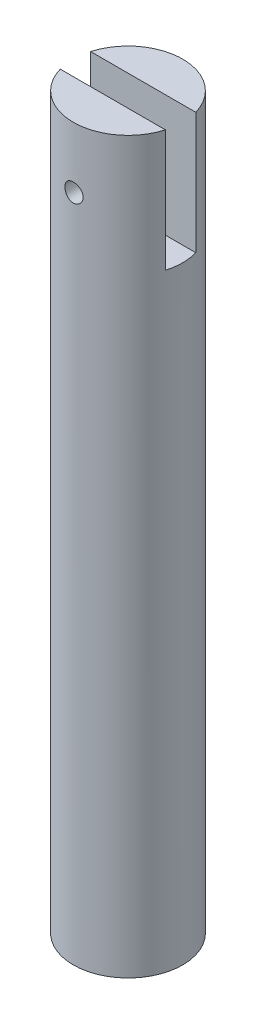
ISO-10303-21;
HEADER;
FILE_DESCRIPTION(('STEP AP214'),'2;1');
FILE_NAME('part.step','',(''),(''),'','','');
FILE_SCHEMA(('AUTOMOTIVE_DESIGN { 1 0 10303 214 1 1 1 1 }'));
ENDSEC;
DATA;
#1=APPLICATION_CONTEXT('core data for automotive mechanical design processes');
#2=APPLICATION_PROTOCOL_DEFINITION('international standard','automotive_design',2000,#1);
#3=PRODUCT_CONTEXT('',#1,'mechanical');
#4=PRODUCT('Part','Part','',(#3));
#5=PRODUCT_RELATED_PRODUCT_CATEGORY('part','',(#4));
#6=PRODUCT_DEFINITION_FORMATION('','',#4);
#7=PRODUCT_DEFINITION_CONTEXT('part definition',#1,'design');
#8=PRODUCT_DEFINITION('design','',#6,#7);
#9=PRODUCT_DEFINITION_SHAPE('','',#8);
#10=(LENGTH_UNIT() NAMED_UNIT(*) SI_UNIT(.MILLI.,.METRE.));
#11=(NAMED_UNIT(*) PLANE_ANGLE_UNIT() SI_UNIT($,.RADIAN.));
#12=(NAMED_UNIT(*) SI_UNIT($,.STERADIAN.) SOLID_ANGLE_UNIT());
#13=UNCERTAINTY_MEASURE_WITH_UNIT(LENGTH_MEASURE(1.E-05),#10,'distance_accuracy_value','');
#14=(GEOMETRIC_REPRESENTATION_CONTEXT(3) GLOBAL_UNCERTAINTY_ASSIGNED_CONTEXT((#13)) GLOBAL_UNIT_ASSIGNED_CONTEXT((#10,
#11,#12)) REPRESENTATION_CONTEXT('',''));
#15=CARTESIAN_POINT('',(0.,0.,0.));
#16=DIRECTION('',(0.,0.,1.));
#17=DIRECTION('',(1.,0.,0.));
#18=AXIS2_PLACEMENT_3D('',#15,#16,#17);
#19=CARTESIAN_POINT('',(0.,120.,0.));
#20=DIRECTION('',(0.,1.,0.));
#21=DIRECTION('',(0.,0.,1.));
#22=AXIS2_PLACEMENT_3D('',#19,#20,#21);
#23=PLANE('',#22);
#24=DIRECTION('',(1.,0.,0.));
#25=VECTOR('',#24,1.);
#26=CARTESIAN_POINT('',(0.,120.,5.));
#27=LINE('',#26,#25);
#28=CARTESIAN_POINT('',(-17.2916164657906,120.,5.));
#29=VERTEX_POINT('',#28);
#30=CARTESIAN_POINT('',(17.2916164657906,120.,5.));
#31=VERTEX_POINT('',#30);
#32=EDGE_CURVE('E82',#29,#31,#27,.T.);
#33=ORIENTED_EDGE('',*,*,#32,.F.);
#34=CARTESIAN_POINT('',(0.,120.,0.));
#35=DIRECTION('',(0.,1.,0.));
#36=DIRECTION('',(0.,0.,1.));
#37=AXIS2_PLACEMENT_3D('',#34,#35,#36);
#38=CIRCLE('',#37,18.);
#39=EDGE_CURVE('E93',#29,#31,#38,.T.);
#40=ORIENTED_EDGE('',*,*,#39,.T.);
#41=EDGE_LOOP('',(#33,#40));
#42=FACE_BOUND('',#41,.T.);
#43=ADVANCED_FACE('F33',(#42),#23,.T.);
#44=CARTESIAN_POINT('',(0.,120.,0.));
#45=DIRECTION('',(0.,-1.,0.));
#46=DIRECTION('',(0.,0.,-1.));
#47=AXIS2_PLACEMENT_3D('',#44,#45,#46);
#48=CYLINDRICAL_SURFACE('',#47,18.);
#49=CARTESIAN_POINT('',(0.,103.,-18.));
#50=CARTESIAN_POINT('',(-0.167269085949858,102.999993293263,-17.9999971340259));
#51=CARTESIAN_POINT('',(-0.334629458206587,102.985963270037,-17.9976441349564));
#52=CARTESIAN_POINT('',(-0.664656266007653,102.930237209482,-17.9884841392966));
#53=CARTESIAN_POINT('',(-0.827318241551097,102.888515731706,-17.9816730470867));
#54=CARTESIAN_POINT('',(-1.14312569665517,102.778701461689,-17.9643608188374));
#55=CARTESIAN_POINT('',(-1.29627884211828,102.710630241231,-17.9538627019103));
#56=CARTESIAN_POINT('',(-1.58897021037354,102.550105249537,-17.9303307249848));
#57=CARTESIAN_POINT('',(-1.72850998785431,102.45765426702,-17.9172971550532));
#58=CARTESIAN_POINT('',(-1.99136713715002,102.250053899415,-17.8899998094998));
#59=CARTESIAN_POINT('',(-2.11453548424196,102.134717062437,-17.8757264617783));
#60=CARTESIAN_POINT('',(-2.33986619839192,101.885022437833,-17.8476315225208));
#61=CARTESIAN_POINT('',(-2.44202723926917,101.750663450252,-17.833809959552));
#62=CARTESIAN_POINT('',(-2.62304055072616,101.465714840564,-17.8080907891174));
#63=CARTESIAN_POINT('',(-2.70174546343321,101.315030395834,-17.7962055490996));
#64=CARTESIAN_POINT('',(-2.83267003849347,101.002348522839,-17.7758374775361));
#65=CARTESIAN_POINT('',(-2.88489148987874,100.840351859587,-17.7673544161717));
#66=CARTESIAN_POINT('',(-2.96089725334177,100.511223670172,-17.7548464421131));
#67=CARTESIAN_POINT('',(-2.98493883496248,100.344153116198,-17.7507812218284));
#68=CARTESIAN_POINT('',(-3.00470007034785,100.00830366774,-17.7474472672398));
#69=CARTESIAN_POINT('',(-3.0004217284668,99.8395248949992,-17.7481781934866));
#70=CARTESIAN_POINT('',(-2.96387411807538,99.5068865664695,-17.7543171463627));
#71=CARTESIAN_POINT('',(-2.93189385826773,99.3429942357457,-17.759676879827));
#72=CARTESIAN_POINT('',(-2.84130376848414,99.022934418605,-17.7743939425321));
#73=CARTESIAN_POINT('',(-2.78269302518369,98.8667671973338,-17.7837514088793));
#74=CARTESIAN_POINT('',(-2.6402126953127,98.5657254118709,-17.8054617520092));
#75=CARTESIAN_POINT('',(-2.55622309665566,98.4209087127025,-17.8178288052879));
#76=CARTESIAN_POINT('',(-2.36545442106892,98.147314719354,-17.8441550209801));
#77=CARTESIAN_POINT('',(-2.25867350478515,98.0185387210541,-17.8581143118514));
#78=CARTESIAN_POINT('',(-2.02377865459087,97.7790086970312,-17.8862643345574));
#79=CARTESIAN_POINT('',(-1.89541675664775,97.6684977777519,-17.9004557907798));
#80=CARTESIAN_POINT('',(-1.62184229877797,97.4705466848016,-17.9273112167607));
#81=CARTESIAN_POINT('',(-1.4766296302877,97.3831066597801,-17.9399751766769));
#82=CARTESIAN_POINT('',(-1.17324709940005,97.2337573274365,-17.9623667147149));
#83=CARTESIAN_POINT('',(-1.01506647067759,97.1718694968025,-17.9720918208894));
#84=CARTESIAN_POINT('',(-0.690358014723274,97.0756069417048,-17.9874900361519));
#85=CARTESIAN_POINT('',(-0.523830887015358,97.0412299156315,-17.9931634842057));
#86=CARTESIAN_POINT('',(-0.189251881561944,97.0012943698466,-17.9997735581122));
#87=CARTESIAN_POINT('',(-0.0212408845812099,96.9954021138333,-18.0007650361534));
#88=CARTESIAN_POINT('',(0.313367727467868,97.0117136133137,-17.998049693054));
#89=CARTESIAN_POINT('',(0.479965396670449,97.0339162877605,-17.9943430526894));
#90=CARTESIAN_POINT('',(0.805987410656118,97.1055098192026,-17.9826819232584));
#91=CARTESIAN_POINT('',(0.965449042062457,97.1547354500682,-17.9747532576157));
#92=CARTESIAN_POINT('',(1.27385626183253,97.2788014218394,-17.9555335734643));
#93=CARTESIAN_POINT('',(1.42280125909166,97.3536432011623,-17.9442423661442));
#94=CARTESIAN_POINT('',(1.70739682736275,97.5275813496361,-17.9194141956289));
#95=CARTESIAN_POINT('',(1.84291830112458,97.6268861874007,-17.9058582706443));
#96=CARTESIAN_POINT('',(2.09549230260323,97.8466447784621,-17.8780616087028));
#97=CARTESIAN_POINT('',(2.2125434876359,97.967100067932,-17.8638208220586));
#98=CARTESIAN_POINT('',(2.42609133558961,98.2272370576857,-17.8360821028301));
#99=CARTESIAN_POINT('',(2.52236251333647,98.3671049986173,-17.8225933936453));
#100=CARTESIAN_POINT('',(2.69004277235399,98.6612235629663,-17.7980583573346));
#101=CARTESIAN_POINT('',(2.76145264172379,98.815473730273,-17.7870119527922));
#102=CARTESIAN_POINT('',(2.87704599776778,99.1333476793746,-17.7686814443725));
#103=CARTESIAN_POINT('',(2.92134171905754,99.2969297140366,-17.7613818517328));
#104=CARTESIAN_POINT('',(2.98180254453394,99.6293441550661,-17.7513326020231));
#105=CARTESIAN_POINT('',(2.9979700943354,99.7981761036785,-17.7485825493927));
#106=CARTESIAN_POINT('',(3.00164743925682,100.134046199155,-17.7479607970081));
#107=CARTESIAN_POINT('',(2.98951216335022,100.30108045429,-17.7500286780678));
#108=CARTESIAN_POINT('',(2.93769580674822,100.630695097661,-17.7586773774447));
#109=CARTESIAN_POINT('',(2.89801481533497,100.79327550033,-17.7652581811346));
#110=CARTESIAN_POINT('',(2.79236938751388,101.109230124751,-17.7821682753806));
#111=CARTESIAN_POINT('',(2.72643550872053,101.262614812067,-17.792493206636));
#112=CARTESIAN_POINT('',(2.57019240469909,101.556202803034,-17.8157324270665));
#113=CARTESIAN_POINT('',(2.47988197049827,101.696405452447,-17.8286468446608));
#114=CARTESIAN_POINT('',(2.27618266124658,101.961442699729,-17.8558014485475));
#115=CARTESIAN_POINT('',(2.16253267631237,102.08607522004,-17.8700555469156));
#116=CARTESIAN_POINT('',(1.91593083765627,102.31462192537,-17.8981724683301));
#117=CARTESIAN_POINT('',(1.78297453549516,102.418531322366,-17.9120352003186));
#118=CARTESIAN_POINT('',(1.50044300356833,102.60333792184,-17.9379183557066));
#119=CARTESIAN_POINT('',(1.35075934503938,102.684071247176,-17.9499253950372));
#120=CARTESIAN_POINT('',(1.03981568325477,102.819123381532,-17.9706140112213));
#121=CARTESIAN_POINT('',(0.878567393796004,102.873468497296,-17.9792988981298));
#122=CARTESIAN_POINT('',(0.597243972054473,102.942406328952,-17.9904694899955));
#123=CARTESIAN_POINT('',(0.47887059635813,102.963969363539,-17.9940243272803));
#124=CARTESIAN_POINT('',(0.240347172383767,102.992768485414,-17.9987905918334));
#125=CARTESIAN_POINT('',(0.120197154730191,103.000004819365,-18.0000020594477));
#126=CARTESIAN_POINT('',(0.,103.,-18.));
#127=B_SPLINE_CURVE_WITH_KNOTS('',3,(#49,#50,#51,#52,#53,#54,#55,#56,#57,#58,#59,#60,#61,#62,
#63,#64,#65,#66,#67,#68,#69,#70,#71,#72,#73,#74,#75,#76,#77,#78,#79,#80,#81,#82,#83,#84,#85,#86,
#87,#88,#89,#90,#91,#92,#93,#94,#95,#96,#97,#98,#99,#100,#101,#102,#103,#104,#105,#106,#107,
#108,#109,#110,#111,#112,#113,#114,#115,#116,#117,#118,#119,#120,#121,#122,#123,#124,#125,#126),
.UNSPECIFIED.,.T.,.F.,(4,2,2,2,2,2,2,2,2,2,2,2,2,2,2,2,2,2,2,2,2,2,2,2,2,2,2,2,2,2,2,2,2,2,2,2,
2,2,4),(0.,0.501367901926213,1.00319705483451,1.50461624043032,2.00597809520975,2.511629892748,
3.01731360203829,3.52611024988609,4.03487252251419,4.53895292524109,5.04299765185065,
5.5418462611249,6.04071198030458,6.54197467959069,7.04327784816688,7.55079323893592,
8.05831189963019,8.56625626699085,9.0741581342538,9.57609460189678,10.0780117564303,
10.576893684077,11.0758036299128,11.5791219075243,12.0824767566514,12.5910458640914,
13.0995988485113,13.6060322681013,14.1124216534394,14.6124949142724,15.1125665542576,
15.6120578187147,16.1115738603521,16.6170166103207,17.1225760065477,17.6316267792864,
18.1401690255609,18.5004509779682,18.8607267273236),.UNSPECIFIED.);
#128=CARTESIAN_POINT('',(0.,103.,-18.));
#129=VERTEX_POINT('',#128);
#130=EDGE_CURVE('E113',#129,#129,#127,.T.);
#131=ORIENTED_EDGE('',*,*,#130,.T.);
#132=EDGE_LOOP('',(#131));
#133=FACE_BOUND('',#132,.T.);
#134=CARTESIAN_POINT('',(3.,100.,17.7482393492988));
#135=CARTESIAN_POINT('',(2.99999327810379,99.8327491022058,17.7482423683992));
#136=CARTESIAN_POINT('',(2.98596620283394,99.6654068727142,17.7506291086228));
#137=CARTESIAN_POINT('',(2.93025291367965,99.3354177480842,17.7599094864005));
#138=CARTESIAN_POINT('',(2.88854119237033,99.1727753274903,17.7668072801564));
#139=CARTESIAN_POINT('',(2.7787554524046,98.8570092599901,17.7843073124077));
#140=CARTESIAN_POINT('',(2.71070346591839,98.7038777816053,17.7949064542081));
#141=CARTESIAN_POINT('',(2.55022379626737,98.4112228543387,17.8186112652274));
#142=CARTESIAN_POINT('',(2.4577988562016,98.2716978765072,17.8317166523308));
#143=CARTESIAN_POINT('',(2.25022503235985,98.0088245803065,17.8591016538706));
#144=CARTESIAN_POINT('',(2.1348828587188,97.8856298423366,17.8733906079353));
#145=CARTESIAN_POINT('',(1.88516640563433,97.6602480317658,17.901449768023));
#146=CARTESIAN_POINT('',(1.75079099897997,97.5580622042615,17.9152199432608));
#147=CARTESIAN_POINT('',(1.46582744393803,97.3770225193369,17.9407888437925));
#148=CARTESIAN_POINT('',(1.31514729774805,97.2983115907219,17.9525753091881));
#149=CARTESIAN_POINT('',(1.00247474606864,97.1673747153633,17.9727448434851));
#150=CARTESIAN_POINT('',(0.840483076893828,97.1151470465381,17.9811281336719));
#151=CARTESIAN_POINT('',(0.511372471613096,97.0391289580193,17.9934808166928));
#152=CARTESIAN_POINT('',(0.34431466401513,97.0150805007944,17.9974902373309));
#153=CARTESIAN_POINT('',(0.00849034263096122,96.9953010950169,18.0007809521133));
#154=CARTESIAN_POINT('',(-0.160276054234673,96.9995682217033,18.0000625676317));
#155=CARTESIAN_POINT('',(-0.492962622094645,97.0360976218339,17.9940103011767));
#156=CARTESIAN_POINT('',(-0.656914236840163,97.068082196091,17.9887222043088));
#157=CARTESIAN_POINT('',(-0.977090375534144,97.1587012890958,17.9741757452596));
#158=CARTESIAN_POINT('',(-1.1333146639818,97.2173366195074,17.9649172621585));
#159=CARTESIAN_POINT('',(-1.43442737733917,97.3598687683784,17.9433923821435));
#160=CARTESIAN_POINT('',(-1.57926062762285,97.4438800144989,17.9311124079226));
#161=CARTESIAN_POINT('',(-1.85287863581596,97.6346953871621,17.904908856858));
#162=CARTESIAN_POINT('',(-1.98166209349905,97.741501358453,17.8909851470296));
#163=CARTESIAN_POINT('',(-2.221165528136,97.9764145679432,17.8628432187912));
#164=CARTESIAN_POINT('',(-2.33164740270385,98.1047645138812,17.8486234767725));
#165=CARTESIAN_POINT('',(-2.52954550613768,98.378304508259,17.8216555174177));
#166=CARTESIAN_POINT('',(-2.6169615222389,98.5234947120194,17.8089073136559));
#167=CARTESIAN_POINT('',(-2.76629332138594,98.826869970253,17.7863250547418));
#168=CARTESIAN_POINT('',(-2.82818043273509,98.9850693977105,17.7764942796312));
#169=CARTESIAN_POINT('',(-2.92443584497874,99.3098188867691,17.7609142642786));
#170=CARTESIAN_POINT('',(-2.95880656892155,99.4763682117189,17.7551646646599));
#171=CARTESIAN_POINT('',(-2.99871826185512,99.8109593873946,17.7484675130654));
#172=CARTESIAN_POINT('',(-3.00459864949493,99.9789596556425,17.747463429104));
#173=CARTESIAN_POINT('',(-2.98826724321895,100.313544006029,17.7502204173883));
#174=CARTESIAN_POINT('',(-2.9660565343496,100.480128142617,17.7539813055822));
#175=CARTESIAN_POINT('',(-2.89446280191372,100.806073311029,17.7657922494602));
#176=CARTESIAN_POINT('',(-2.84525254877567,100.965473367854,17.7738150230202));
#177=CARTESIAN_POINT('',(-2.72123782823074,101.273764199535,17.793222876066));
#178=CARTESIAN_POINT('',(-2.64643182972113,101.422654345061,17.8046081566869));
#179=CARTESIAN_POINT('',(-2.47254800787508,101.707209513287,17.8295895407687));
#180=CARTESIAN_POINT('',(-2.37325267699124,101.842739887307,17.8432050672042));
#181=CARTESIAN_POINT('',(-2.15350735884958,102.095336239234,17.8710560001584));
#182=CARTESIAN_POINT('',(-2.03305588366085,102.212400917332,17.885291450224));
#183=CARTESIAN_POINT('',(-1.77291368439457,102.425982271274,17.9129570654192));
#184=CARTESIAN_POINT('',(-1.63303590406344,102.522272591541,17.9263773161361));
#185=CARTESIAN_POINT('',(-1.3388921375392,102.689986392406,17.9507413491953));
#186=CARTESIAN_POINT('',(-1.18462661696476,102.761410677369,17.9616852116397));
#187=CARTESIAN_POINT('',(-0.866758861801606,102.877012700746,17.979820298035));
#188=CARTESIAN_POINT('',(-0.703200675123145,102.921308890882,17.9870278148114));
#189=CARTESIAN_POINT('',(-0.370836881849063,102.981778718757,17.9969469980314));
#190=CARTESIAN_POINT('',(-0.202031708185953,102.997954670479,17.9996590344023));
#191=CARTESIAN_POINT('',(0.133849530928403,103.001658258775,18.0002764546537));
#192=CARTESIAN_POINT('',(0.300921792723188,102.989530304729,17.9982396242903));
#193=CARTESIAN_POINT('',(0.630614369177637,102.937715293277,17.989706140648));
#194=CARTESIAN_POINT('',(0.793234708760968,102.898028390188,17.9832095123422));
#195=CARTESIAN_POINT('',(1.10927573510224,102.792354201348,17.9664838659288));
#196=CARTESIAN_POINT('',(1.26270644658458,102.726396198148,17.9562590044905));
#197=CARTESIAN_POINT('',(1.55637654357859,102.570090476523,17.9331930825364));
#198=CARTESIAN_POINT('',(1.69661530334186,102.479741601925,17.920351898009));
#199=CARTESIAN_POINT('',(1.96165553463167,102.275997889047,17.8932915553969));
#200=CARTESIAN_POINT('',(2.08626171672329,102.162350854299,17.8790582944934));
#201=CARTESIAN_POINT('',(2.31475665114109,101.915766030515,17.8509156397724));
#202=CARTESIAN_POINT('',(2.41864054405427,101.782823729305,17.8370063225941));
#203=CARTESIAN_POINT('',(2.60341712509303,101.500305613012,17.8109801224069));
#204=CARTESIAN_POINT('',(2.68414198686924,101.350618792281,17.7988766141494));
#205=CARTESIAN_POINT('',(2.81917744368512,101.039668916994,17.7779905210958));
#206=CARTESIAN_POINT('',(2.87351442626768,100.878417612787,17.7692046206985));
#207=CARTESIAN_POINT('',(2.9424312637529,100.597115476615,17.7578969382779));
#208=CARTESIAN_POINT('',(2.96398490120567,100.478767830445,17.7542954810336));
#209=CARTESIAN_POINT('',(2.99277155421758,100.240295818196,17.7494656234569));
#210=CARTESIAN_POINT('',(3.00000482975133,100.120171484411,17.7482371800443));
#211=CARTESIAN_POINT('',(3.,100.,17.7482393492988));
#212=B_SPLINE_CURVE_WITH_KNOTS('',3,(#134,#135,#136,#137,#138,#139,#140,#141,#142,#143,#144,
#145,#146,#147,#148,#149,#150,#151,#152,#153,#154,#155,#156,#157,#158,#159,#160,#161,#162,#163,
#164,#165,#166,#167,#168,#169,#170,#171,#172,#173,#174,#175,#176,#177,#178,#179,#180,#181,#182,
#183,#184,#185,#186,#187,#188,#189,#190,#191,#192,#193,#194,#195,#196,#197,#198,#199,#200,#201,
#202,#203,#204,#205,#206,#207,#208,#209,#210,#211),.UNSPECIFIED.,.T.,.F.,(4,2,2,2,2,2,2,2,2,2,2,
2,2,2,2,2,2,2,2,2,2,2,2,2,2,2,2,2,2,2,2,2,2,2,2,2,2,2,4),(0.,0.501313246713286,1.00308902395556,
1.50444599745022,2.00574656886328,2.51146990986857,3.01722321401337,3.52599576133722,
4.03473522133335,4.53877880967078,5.0427881358323,5.54180545397601,6.04083797099439,
6.54215524967309,7.04351311472116,7.55095348154549,8.05839852895223,8.56641194998323,
9.07438063125693,9.57628250904493,10.0781650009677,10.5768727756259,11.0756103875229,
11.5789481131524,12.0823212531683,12.5909293564246,13.0995210057204,13.6058758130117,
14.1121889509482,14.612373315191,15.1125548786259,15.6121804779895,16.111829764708,
16.617203969559,17.1226965465817,17.6317647314198,18.1403228009334,18.5005280465252,
18.8607267528218),.UNSPECIFIED.);
#213=CARTESIAN_POINT('',(3.,100.,17.7482393492988));
#214=VERTEX_POINT('',#213);
#215=EDGE_CURVE('E120',#214,#214,#212,.T.);
#216=ORIENTED_EDGE('',*,*,#215,.T.);
#217=EDGE_LOOP('',(#216));
#218=FACE_BOUND('',#217,.T.);
#219=CARTESIAN_POINT('',(0.,80.,0.));
#220=DIRECTION('',(0.,1.,0.));
#221=DIRECTION('',(0.,0.,1.));
#222=AXIS2_PLACEMENT_3D('',#219,#220,#221);
#223=CIRCLE('',#222,18.);
#224=CARTESIAN_POINT('',(17.2916164657906,80.,5.));
#225=VERTEX_POINT('',#224);
#226=CARTESIAN_POINT('',(17.2916164657906,80.,-5.));
#227=VERTEX_POINT('',#226);
#228=EDGE_CURVE('E11',#225,#227,#223,.T.);
#229=ORIENTED_EDGE('',*,*,#228,.F.);
#230=DIRECTION('',(0.,-1.,0.));
#231=VECTOR('',#230,1.);
#232=CARTESIAN_POINT('',(17.2916164657906,120.,5.));
#233=LINE('',#232,#231);
#234=EDGE_CURVE('E58',#225,#31,#233,.F.);
#235=ORIENTED_EDGE('',*,*,#234,.T.);
#236=ORIENTED_EDGE('',*,*,#39,.F.);
#237=DIRECTION('',(0.,-1.,0.));
#238=VECTOR('',#237,1.);
#239=CARTESIAN_POINT('',(-17.2916164657906,120.,5.));
#240=LINE('',#239,#238);
#241=CARTESIAN_POINT('',(-17.2916164657906,80.,5.));
#242=VERTEX_POINT('',#241);
#243=EDGE_CURVE('E99',#29,#242,#240,.T.);
#244=ORIENTED_EDGE('',*,*,#243,.T.);
#245=CARTESIAN_POINT('',(-17.2916164657906,80.,-5.));
#246=VERTEX_POINT('',#245);
#247=EDGE_CURVE('E43',#246,#242,#223,.T.);
#248=ORIENTED_EDGE('',*,*,#247,.F.);
#249=DIRECTION('',(0.,-1.,0.));
#250=VECTOR('',#249,1.);
#251=CARTESIAN_POINT('',(-17.2916164657906,120.,-5.));
#252=LINE('',#251,#250);
#253=CARTESIAN_POINT('',(-17.2916164657906,120.,-5.));
#254=VERTEX_POINT('',#253);
#255=EDGE_CURVE('E77',#246,#254,#252,.F.);
#256=ORIENTED_EDGE('',*,*,#255,.T.);
#257=CARTESIAN_POINT('',(17.2916164657906,120.,-5.));
#258=VERTEX_POINT('',#257);
#259=EDGE_CURVE('E83',#258,#254,#38,.T.);
#260=ORIENTED_EDGE('',*,*,#259,.F.);
#261=DIRECTION('',(0.,-1.,0.));
#262=VECTOR('',#261,1.);
#263=CARTESIAN_POINT('',(17.2916164657906,120.,-5.));
#264=LINE('',#263,#262);
#265=EDGE_CURVE('E50',#258,#227,#264,.T.);
#266=ORIENTED_EDGE('',*,*,#265,.T.);
#267=EDGE_LOOP('',(#229,#235,#236,#244,#248,#256,#260,#266));
#268=FACE_BOUND('',#267,.T.);
#269=CARTESIAN_POINT('',(0.,-120.,0.));
#270=DIRECTION('',(0.,1.,0.));
#271=DIRECTION('',(0.,0.,1.));
#272=AXIS2_PLACEMENT_3D('',#269,#270,#271);
#273=CIRCLE('',#272,18.);
#274=CARTESIAN_POINT('',(0.,-120.,18.));
#275=VERTEX_POINT('',#274);
#276=EDGE_CURVE('E96',#275,#275,#273,.T.);
#277=ORIENTED_EDGE('',*,*,#276,.T.);
#278=EDGE_LOOP('',(#277));
#279=FACE_BOUND('',#278,.T.);
#280=ADVANCED_FACE('F35',(#133,#218,#268,#279),#48,.T.);
#281=DIRECTION('',(-1.,0.,0.));
#282=VECTOR('',#281,1.);
#283=CARTESIAN_POINT('',(0.,120.,-5.));
#284=LINE('',#283,#282);
#285=EDGE_CURVE('E74',#258,#254,#284,.T.);
#286=ORIENTED_EDGE('',*,*,#285,.F.);
#287=ORIENTED_EDGE('',*,*,#259,.T.);
#288=EDGE_LOOP('',(#286,#287));
#289=FACE_BOUND('',#288,.T.);
#290=ADVANCED_FACE('F92',(#289),#23,.T.);
#291=CARTESIAN_POINT('',(0.,-120.,0.));
#292=DIRECTION('',(0.,1.,0.));
#293=DIRECTION('',(0.,0.,1.));
#294=AXIS2_PLACEMENT_3D('',#291,#292,#293);
#295=PLANE('',#294);
#296=ORIENTED_EDGE('',*,*,#276,.F.);
#297=EDGE_LOOP('',(#296));
#298=FACE_BOUND('',#297,.T.);
#299=ADVANCED_FACE('F134',(#298),#295,.F.);
#300=CARTESIAN_POINT('',(0.,80.,0.));
#301=DIRECTION('',(0.,1.,0.));
#302=DIRECTION('',(0.,0.,1.));
#303=AXIS2_PLACEMENT_3D('',#300,#301,#302);
#304=PLANE('',#303);
#305=ORIENTED_EDGE('',*,*,#228,.T.);
#306=DIRECTION('',(-1.,0.,0.));
#307=VECTOR('',#306,1.);
#308=CARTESIAN_POINT('',(-25.,80.,-5.));
#309=LINE('',#308,#307);
#310=EDGE_CURVE('E105',#227,#246,#309,.T.);
#311=ORIENTED_EDGE('',*,*,#310,.T.);
#312=ORIENTED_EDGE('',*,*,#247,.T.);
#313=DIRECTION('',(1.,0.,0.));
#314=VECTOR('',#313,1.);
#315=CARTESIAN_POINT('',(-25.,80.,5.));
#316=LINE('',#315,#314);
#317=EDGE_CURVE('E90',#242,#225,#316,.T.);
#318=ORIENTED_EDGE('',*,*,#317,.T.);
#319=EDGE_LOOP('',(#305,#311,#312,#318));
#320=FACE_BOUND('',#319,.T.);
#321=ADVANCED_FACE('F104',(#320),#304,.T.);
#322=CARTESIAN_POINT('',(-25.,80.,5.));
#323=DIRECTION('',(0.,0.,1.));
#324=DIRECTION('',(1.,0.,0.));
#325=AXIS2_PLACEMENT_3D('',#322,#323,#324);
#326=PLANE('',#325);
#327=CARTESIAN_POINT('',(0.,100.,5.));
#328=DIRECTION('',(0.,0.,1.));
#329=DIRECTION('',(1.,0.,0.));
#330=AXIS2_PLACEMENT_3D('',#327,#328,#329);
#331=CIRCLE('',#330,3.);
#332=CARTESIAN_POINT('',(3.,100.,5.));
#333=VERTEX_POINT('',#332);
#334=EDGE_CURVE('E160',#333,#333,#331,.T.);
#335=ORIENTED_EDGE('',*,*,#334,.T.);
#336=EDGE_LOOP('',(#335));
#337=FACE_BOUND('',#336,.T.);
#338=ORIENTED_EDGE('',*,*,#32,.T.);
#339=ORIENTED_EDGE('',*,*,#234,.F.);
#340=ORIENTED_EDGE('',*,*,#317,.F.);
#341=ORIENTED_EDGE('',*,*,#243,.F.);
#342=EDGE_LOOP('',(#338,#339,#340,#341));
#343=FACE_BOUND('',#342,.T.);
#344=ADVANCED_FACE('F106',(#337,#343),#326,.F.);
#345=CARTESIAN_POINT('',(-25.,80.,-5.));
#346=DIRECTION('',(0.,0.,-1.));
#347=DIRECTION('',(-1.,0.,0.));
#348=AXIS2_PLACEMENT_3D('',#345,#346,#347);
#349=PLANE('',#348);
#350=CARTESIAN_POINT('',(0.,100.,-5.));
#351=DIRECTION('',(0.,0.,-1.));
#352=DIRECTION('',(-1.,0.,0.));
#353=AXIS2_PLACEMENT_3D('',#350,#351,#352);
#354=CIRCLE('',#353,3.);
#355=CARTESIAN_POINT('',(-3.,100.,-5.));
#356=VERTEX_POINT('',#355);
#357=EDGE_CURVE('E38',#356,#356,#354,.T.);
#358=ORIENTED_EDGE('',*,*,#357,.T.);
#359=EDGE_LOOP('',(#358));
#360=FACE_BOUND('',#359,.T.);
#361=ORIENTED_EDGE('',*,*,#285,.T.);
#362=ORIENTED_EDGE('',*,*,#255,.F.);
#363=ORIENTED_EDGE('',*,*,#310,.F.);
#364=ORIENTED_EDGE('',*,*,#265,.F.);
#365=EDGE_LOOP('',(#361,#362,#363,#364));
#366=FACE_BOUND('',#365,.T.);
#367=ADVANCED_FACE('F76',(#360,#366),#349,.F.);
#368=CARTESIAN_POINT('',(0.,100.,-18.));
#369=DIRECTION('',(0.,0.,1.));
#370=DIRECTION('',(1.,0.,0.));
#371=AXIS2_PLACEMENT_3D('',#368,#369,#370);
#372=CYLINDRICAL_SURFACE('',#371,3.);
#373=ORIENTED_EDGE('',*,*,#357,.F.);
#374=EDGE_LOOP('',(#373));
#375=FACE_BOUND('',#374,.T.);
#376=ORIENTED_EDGE('',*,*,#130,.F.);
#377=EDGE_LOOP('',(#376));
#378=FACE_BOUND('',#377,.T.);
#379=ADVANCED_FACE('F125',(#375,#378),#372,.F.);
#380=ORIENTED_EDGE('',*,*,#334,.F.);
#381=EDGE_LOOP('',(#380));
#382=FACE_BOUND('',#381,.T.);
#383=ORIENTED_EDGE('',*,*,#215,.F.);
#384=EDGE_LOOP('',(#383));
#385=FACE_BOUND('',#384,.T.);
#386=ADVANCED_FACE('F129',(#382,#385),#372,.F.);
#387=CLOSED_SHELL('',(#43,#280,#290,#299,#321,#344,#367,#379,#386));
#388=MANIFOLD_SOLID_BREP('B2',#387);
#389=ADVANCED_BREP_SHAPE_REPRESENTATION('',(#18,#388),#14);
#390=SHAPE_DEFINITION_REPRESENTATION(#9,#389);
ENDSEC;
END-ISO-10303-21;
